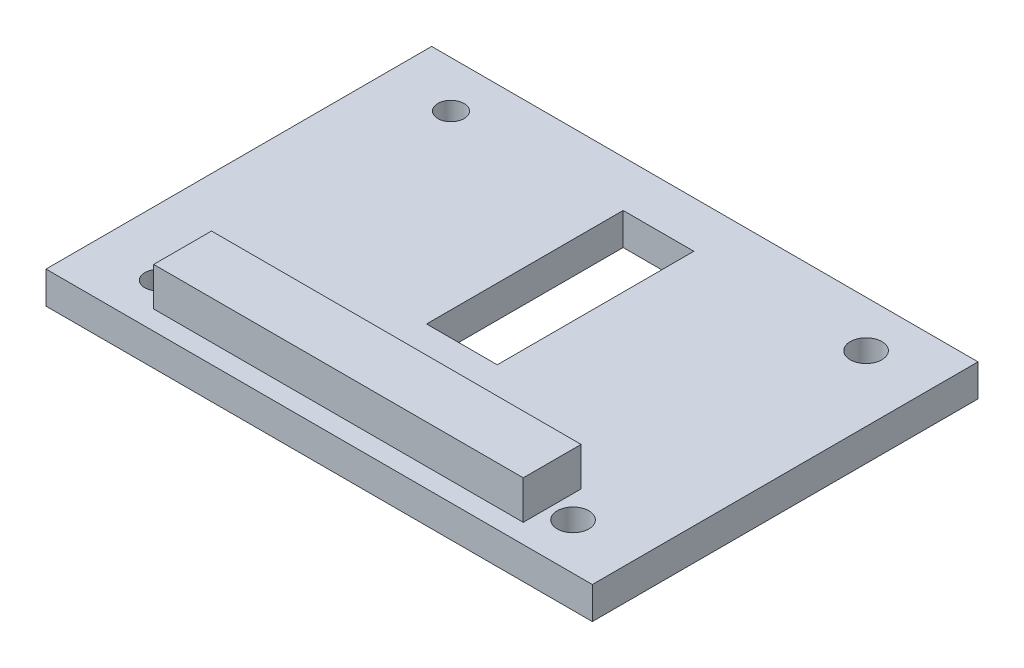
ISO-10303-21;
HEADER;
FILE_DESCRIPTION(('STEP AP214'),'2;1');
FILE_NAME('part.step','',(''),(''),'','','');
FILE_SCHEMA(('AUTOMOTIVE_DESIGN { 1 0 10303 214 1 1 1 1 }'));
ENDSEC;
DATA;
#1=APPLICATION_CONTEXT('core data for automotive mechanical design processes');
#2=APPLICATION_PROTOCOL_DEFINITION('international standard','automotive_design',2000,#1);
#3=PRODUCT_CONTEXT('',#1,'mechanical');
#4=PRODUCT('Part','Part','',(#3));
#5=PRODUCT_RELATED_PRODUCT_CATEGORY('part','',(#4));
#6=PRODUCT_DEFINITION_FORMATION('','',#4);
#7=PRODUCT_DEFINITION_CONTEXT('part definition',#1,'design');
#8=PRODUCT_DEFINITION('design','',#6,#7);
#9=PRODUCT_DEFINITION_SHAPE('','',#8);
#10=(LENGTH_UNIT() NAMED_UNIT(*) SI_UNIT(.MILLI.,.METRE.));
#11=(NAMED_UNIT(*) PLANE_ANGLE_UNIT() SI_UNIT($,.RADIAN.));
#12=(NAMED_UNIT(*) SI_UNIT($,.STERADIAN.) SOLID_ANGLE_UNIT());
#13=UNCERTAINTY_MEASURE_WITH_UNIT(LENGTH_MEASURE(1.E-05),#10,'distance_accuracy_value','');
#14=(GEOMETRIC_REPRESENTATION_CONTEXT(3) GLOBAL_UNCERTAINTY_ASSIGNED_CONTEXT((#13)) GLOBAL_UNIT_ASSIGNED_CONTEXT((#10,
#11,#12)) REPRESENTATION_CONTEXT('',''));
#15=CARTESIAN_POINT('',(0.,0.,0.));
#16=DIRECTION('',(0.,0.,1.));
#17=DIRECTION('',(1.,0.,0.));
#18=AXIS2_PLACEMENT_3D('',#15,#16,#17);
#19=CARTESIAN_POINT('',(0.,10.,0.));
#20=DIRECTION('',(0.,-1.,0.));
#21=DIRECTION('',(0.,0.,-1.));
#22=AXIS2_PLACEMENT_3D('',#19,#20,#21);
#23=PLANE('',#22);
#24=DIRECTION('',(0.,0.,-1.));
#25=VECTOR('',#24,1.);
#26=CARTESIAN_POINT('',(11.,10.,15.5889145496536));
#27=LINE('',#26,#25);
#28=CARTESIAN_POINT('',(11.,10.,15.5889145496536));
#29=VERTEX_POINT('',#28);
#30=CARTESIAN_POINT('',(11.,10.,-45.5889145496536));
#31=VERTEX_POINT('',#30);
#32=EDGE_CURVE('E160',#29,#31,#27,.T.);
#33=ORIENTED_EDGE('',*,*,#32,.F.);
#34=DIRECTION('',(1.,0.,0.));
#35=VECTOR('',#34,1.);
#36=CARTESIAN_POINT('',(-11.,10.,15.5889145496536));
#37=LINE('',#36,#35);
#38=CARTESIAN_POINT('',(-11.,10.,15.5889145496536));
#39=VERTEX_POINT('',#38);
#40=EDGE_CURVE('E168',#39,#29,#37,.T.);
#41=ORIENTED_EDGE('',*,*,#40,.F.);
#42=DIRECTION('',(0.,0.,1.));
#43=VECTOR('',#42,1.);
#44=CARTESIAN_POINT('',(-11.,10.,15.5889145496536));
#45=LINE('',#44,#43);
#46=CARTESIAN_POINT('',(-11.,10.,-45.5889145496536));
#47=VERTEX_POINT('',#46);
#48=EDGE_CURVE('E165',#47,#39,#45,.T.);
#49=ORIENTED_EDGE('',*,*,#48,.F.);
#50=DIRECTION('',(-1.,0.,0.));
#51=VECTOR('',#50,1.);
#52=CARTESIAN_POINT('',(-11.,10.,-45.5889145496536));
#53=LINE('',#52,#51);
#54=EDGE_CURVE('E162',#31,#47,#53,.T.);
#55=ORIENTED_EDGE('',*,*,#54,.F.);
#56=EDGE_LOOP('',(#33,#41,#49,#55));
#57=FACE_BOUND('',#56,.T.);
#58=DIRECTION('',(0.,0.,-1.));
#59=VECTOR('',#58,1.);
#60=CARTESIAN_POINT('',(85.,10.,60.));
#61=LINE('',#60,#59);
#62=CARTESIAN_POINT('',(85.,10.,60.));
#63=VERTEX_POINT('',#62);
#64=CARTESIAN_POINT('',(85.,10.,-60.));
#65=VERTEX_POINT('',#64);
#66=EDGE_CURVE('E215',#63,#65,#61,.T.);
#67=ORIENTED_EDGE('',*,*,#66,.T.);
#68=DIRECTION('',(-1.,0.,0.));
#69=VECTOR('',#68,1.);
#70=CARTESIAN_POINT('',(-85.,10.,-60.));
#71=LINE('',#70,#69);
#72=CARTESIAN_POINT('',(-85.,10.,-60.));
#73=VERTEX_POINT('',#72);
#74=EDGE_CURVE('E218',#65,#73,#71,.T.);
#75=ORIENTED_EDGE('',*,*,#74,.T.);
#76=DIRECTION('',(0.,0.,1.));
#77=VECTOR('',#76,1.);
#78=CARTESIAN_POINT('',(-85.,10.,60.));
#79=LINE('',#78,#77);
#80=CARTESIAN_POINT('',(-85.,10.,60.));
#81=VERTEX_POINT('',#80);
#82=EDGE_CURVE('E221',#73,#81,#79,.T.);
#83=ORIENTED_EDGE('',*,*,#82,.T.);
#84=DIRECTION('',(1.,0.,0.));
#85=VECTOR('',#84,1.);
#86=CARTESIAN_POINT('',(-85.,10.,60.));
#87=LINE('',#86,#85);
#88=EDGE_CURVE('E223',#81,#63,#87,.T.);
#89=ORIENTED_EDGE('',*,*,#88,.T.);
#90=EDGE_LOOP('',(#67,#75,#83,#89));
#91=FACE_BOUND('',#90,.T.);
#92=CARTESIAN_POINT('',(-64.5842956120092,10.,45.5889145496536));
#93=DIRECTION('',(0.,1.,0.));
#94=DIRECTION('',(0.,0.,1.));
#95=AXIS2_PLACEMENT_3D('',#92,#93,#94);
#96=CIRCLE('',#95,4.08429561200924);
#97=CARTESIAN_POINT('',(-64.5842956120092,10.,49.6732101616628));
#98=VERTEX_POINT('',#97);
#99=EDGE_CURVE('E209',#98,#98,#96,.T.);
#100=ORIENTED_EDGE('',*,*,#99,.F.);
#101=EDGE_LOOP('',(#100));
#102=FACE_BOUND('',#101,.T.);
#103=CARTESIAN_POINT('',(64.5842956120092,10.,45.5889145496536));
#104=DIRECTION('',(0.,1.,0.));
#105=DIRECTION('',(0.,0.,1.));
#106=AXIS2_PLACEMENT_3D('',#103,#104,#105);
#107=CIRCLE('',#106,4.91570438799077);
#108=CARTESIAN_POINT('',(64.5842956120092,10.,50.5046189376444));
#109=VERTEX_POINT('',#108);
#110=EDGE_CURVE('E203',#109,#109,#107,.T.);
#111=ORIENTED_EDGE('',*,*,#110,.F.);
#112=EDGE_LOOP('',(#111));
#113=FACE_BOUND('',#112,.T.);
#114=CARTESIAN_POINT('',(-64.5842956120092,10.,-45.5889145496536));
#115=DIRECTION('',(0.,1.,0.));
#116=DIRECTION('',(0.,0.,1.));
#117=AXIS2_PLACEMENT_3D('',#114,#115,#116);
#118=CIRCLE('',#117,4.08429561200924);
#119=CARTESIAN_POINT('',(-64.5842956120092,10.,-41.5046189376443));
#120=VERTEX_POINT('',#119);
#121=EDGE_CURVE('E197',#120,#120,#118,.T.);
#122=ORIENTED_EDGE('',*,*,#121,.F.);
#123=EDGE_LOOP('',(#122));
#124=FACE_BOUND('',#123,.T.);
#125=CARTESIAN_POINT('',(64.5842956120092,10.,-45.5889145496536));
#126=DIRECTION('',(0.,1.,0.));
#127=DIRECTION('',(0.,0.,1.));
#128=AXIS2_PLACEMENT_3D('',#125,#126,#127);
#129=CIRCLE('',#128,4.91570438799077);
#130=CARTESIAN_POINT('',(64.5842956120092,10.,-40.6732101616628));
#131=VERTEX_POINT('',#130);
#132=EDGE_CURVE('E191',#131,#131,#129,.T.);
#133=ORIENTED_EDGE('',*,*,#132,.F.);
#134=EDGE_LOOP('',(#133));
#135=FACE_BOUND('',#134,.T.);
#136=DIRECTION('',(0.,0.,-1.));
#137=VECTOR('',#136,1.);
#138=CARTESIAN_POINT('',(57.5,10.,0.));
#139=LINE('',#138,#137);
#140=CARTESIAN_POINT('',(57.5,10.,54.));
#141=VERTEX_POINT('',#140);
#142=CARTESIAN_POINT('',(57.5,10.,36.));
#143=VERTEX_POINT('',#142);
#144=EDGE_CURVE('E147',#141,#143,#139,.T.);
#145=ORIENTED_EDGE('',*,*,#144,.F.);
#146=DIRECTION('',(1.,0.,0.));
#147=VECTOR('',#146,1.);
#148=CARTESIAN_POINT('',(0.,10.,54.));
#149=LINE('',#148,#147);
#150=CARTESIAN_POINT('',(-57.5,10.,54.));
#151=VERTEX_POINT('',#150);
#152=EDGE_CURVE('E148',#151,#141,#149,.T.);
#153=ORIENTED_EDGE('',*,*,#152,.F.);
#154=DIRECTION('',(0.,0.,1.));
#155=VECTOR('',#154,1.);
#156=CARTESIAN_POINT('',(-57.5,10.,0.));
#157=LINE('',#156,#155);
#158=CARTESIAN_POINT('',(-57.5,10.,36.));
#159=VERTEX_POINT('',#158);
#160=EDGE_CURVE('E59',#159,#151,#157,.T.);
#161=ORIENTED_EDGE('',*,*,#160,.F.);
#162=DIRECTION('',(-1.,0.,0.));
#163=VECTOR('',#162,1.);
#164=CARTESIAN_POINT('',(0.,10.,36.));
#165=LINE('',#164,#163);
#166=EDGE_CURVE('E54',#143,#159,#165,.T.);
#167=ORIENTED_EDGE('',*,*,#166,.F.);
#168=EDGE_LOOP('',(#145,#153,#161,#167));
#169=FACE_BOUND('',#168,.T.);
#170=ADVANCED_FACE('F39',(#57,#91,#102,#113,#124,#135,#169),#23,.F.);
#171=CARTESIAN_POINT('',(0.,0.,0.));
#172=DIRECTION('',(0.,-1.,0.));
#173=DIRECTION('',(0.,0.,-1.));
#174=AXIS2_PLACEMENT_3D('',#171,#172,#173);
#175=PLANE('',#174);
#176=CARTESIAN_POINT('',(-64.5842956120092,0.,-45.5889145496536));
#177=DIRECTION('',(0.,1.,0.));
#178=DIRECTION('',(0.,0.,1.));
#179=AXIS2_PLACEMENT_3D('',#176,#177,#178);
#180=CIRCLE('',#179,4.08429561200924);
#181=CARTESIAN_POINT('',(-64.5842956120092,0.,-41.5046189376443));
#182=VERTEX_POINT('',#181);
#183=EDGE_CURVE('E194',#182,#182,#180,.T.);
#184=ORIENTED_EDGE('',*,*,#183,.T.);
#185=EDGE_LOOP('',(#184));
#186=FACE_BOUND('',#185,.T.);
#187=CARTESIAN_POINT('',(-64.5842956120092,0.,45.5889145496536));
#188=DIRECTION('',(0.,1.,0.));
#189=DIRECTION('',(0.,0.,1.));
#190=AXIS2_PLACEMENT_3D('',#187,#188,#189);
#191=CIRCLE('',#190,4.08429561200924);
#192=CARTESIAN_POINT('',(-64.5842956120092,0.,49.6732101616628));
#193=VERTEX_POINT('',#192);
#194=EDGE_CURVE('E206',#193,#193,#191,.T.);
#195=ORIENTED_EDGE('',*,*,#194,.T.);
#196=EDGE_LOOP('',(#195));
#197=FACE_BOUND('',#196,.T.);
#198=DIRECTION('',(0.,0.,-1.));
#199=VECTOR('',#198,1.);
#200=CARTESIAN_POINT('',(85.,0.,60.));
#201=LINE('',#200,#199);
#202=CARTESIAN_POINT('',(85.,0.,60.));
#203=VERTEX_POINT('',#202);
#204=CARTESIAN_POINT('',(85.,0.,-60.));
#205=VERTEX_POINT('',#204);
#206=EDGE_CURVE('E212',#203,#205,#201,.T.);
#207=ORIENTED_EDGE('',*,*,#206,.F.);
#208=DIRECTION('',(1.,0.,0.));
#209=VECTOR('',#208,1.);
#210=CARTESIAN_POINT('',(-85.,0.,60.));
#211=LINE('',#210,#209);
#212=CARTESIAN_POINT('',(-85.,0.,60.));
#213=VERTEX_POINT('',#212);
#214=EDGE_CURVE('E219',#213,#203,#211,.T.);
#215=ORIENTED_EDGE('',*,*,#214,.F.);
#216=DIRECTION('',(0.,0.,1.));
#217=VECTOR('',#216,1.);
#218=CARTESIAN_POINT('',(-85.,0.,60.));
#219=LINE('',#218,#217);
#220=CARTESIAN_POINT('',(-85.,0.,-60.));
#221=VERTEX_POINT('',#220);
#222=EDGE_CURVE('E230',#221,#213,#219,.T.);
#223=ORIENTED_EDGE('',*,*,#222,.F.);
#224=DIRECTION('',(-1.,0.,0.));
#225=VECTOR('',#224,1.);
#226=CARTESIAN_POINT('',(-85.,0.,-60.));
#227=LINE('',#226,#225);
#228=EDGE_CURVE('E228',#205,#221,#227,.T.);
#229=ORIENTED_EDGE('',*,*,#228,.F.);
#230=EDGE_LOOP('',(#207,#215,#223,#229));
#231=FACE_BOUND('',#230,.T.);
#232=CARTESIAN_POINT('',(64.5842956120092,0.,45.5889145496536));
#233=DIRECTION('',(0.,1.,0.));
#234=DIRECTION('',(0.,0.,1.));
#235=AXIS2_PLACEMENT_3D('',#232,#233,#234);
#236=CIRCLE('',#235,4.91570438799077);
#237=CARTESIAN_POINT('',(64.5842956120092,0.,50.5046189376444));
#238=VERTEX_POINT('',#237);
#239=EDGE_CURVE('E200',#238,#238,#236,.T.);
#240=ORIENTED_EDGE('',*,*,#239,.T.);
#241=EDGE_LOOP('',(#240));
#242=FACE_BOUND('',#241,.T.);
#243=CARTESIAN_POINT('',(64.5842956120092,0.,-45.5889145496536));
#244=DIRECTION('',(0.,1.,0.));
#245=DIRECTION('',(0.,0.,1.));
#246=AXIS2_PLACEMENT_3D('',#243,#244,#245);
#247=CIRCLE('',#246,4.91570438799077);
#248=CARTESIAN_POINT('',(64.5842956120092,0.,-40.6732101616628));
#249=VERTEX_POINT('',#248);
#250=EDGE_CURVE('E190',#249,#249,#247,.T.);
#251=ORIENTED_EDGE('',*,*,#250,.T.);
#252=EDGE_LOOP('',(#251));
#253=FACE_BOUND('',#252,.T.);
#254=DIRECTION('',(1.,0.,0.));
#255=VECTOR('',#254,1.);
#256=CARTESIAN_POINT('',(-11.,0.,15.5889145496536));
#257=LINE('',#256,#255);
#258=CARTESIAN_POINT('',(-11.,0.,15.5889145496536));
#259=VERTEX_POINT('',#258);
#260=CARTESIAN_POINT('',(11.,0.,15.5889145496536));
#261=VERTEX_POINT('',#260);
#262=EDGE_CURVE('E163',#259,#261,#257,.T.);
#263=ORIENTED_EDGE('',*,*,#262,.T.);
#264=DIRECTION('',(0.,0.,-1.));
#265=VECTOR('',#264,1.);
#266=CARTESIAN_POINT('',(11.,0.,15.5889145496536));
#267=LINE('',#266,#265);
#268=CARTESIAN_POINT('',(11.,0.,-45.5889145496536));
#269=VERTEX_POINT('',#268);
#270=EDGE_CURVE('E159',#261,#269,#267,.T.);
#271=ORIENTED_EDGE('',*,*,#270,.T.);
#272=DIRECTION('',(-1.,0.,0.));
#273=VECTOR('',#272,1.);
#274=CARTESIAN_POINT('',(-11.,0.,-45.5889145496536));
#275=LINE('',#274,#273);
#276=CARTESIAN_POINT('',(-11.,0.,-45.5889145496536));
#277=VERTEX_POINT('',#276);
#278=EDGE_CURVE('E173',#269,#277,#275,.T.);
#279=ORIENTED_EDGE('',*,*,#278,.T.);
#280=DIRECTION('',(0.,0.,1.));
#281=VECTOR('',#280,1.);
#282=CARTESIAN_POINT('',(-11.,0.,15.5889145496536));
#283=LINE('',#282,#281);
#284=EDGE_CURVE('E176',#277,#259,#283,.T.);
#285=ORIENTED_EDGE('',*,*,#284,.T.);
#286=EDGE_LOOP('',(#263,#271,#279,#285));
#287=FACE_BOUND('',#286,.T.);
#288=ADVANCED_FACE('F248',(#186,#197,#231,#242,#253,#287),#175,.T.);
#289=CARTESIAN_POINT('',(85.,10.,60.));
#290=DIRECTION('',(-1.,0.,0.));
#291=DIRECTION('',(0.,0.,1.));
#292=AXIS2_PLACEMENT_3D('',#289,#290,#291);
#293=PLANE('',#292);
#294=ORIENTED_EDGE('',*,*,#206,.T.);
#295=DIRECTION('',(0.,-1.,0.));
#296=VECTOR('',#295,1.);
#297=CARTESIAN_POINT('',(85.,10.,-60.));
#298=LINE('',#297,#296);
#299=EDGE_CURVE('E11',#65,#205,#298,.T.);
#300=ORIENTED_EDGE('',*,*,#299,.F.);
#301=ORIENTED_EDGE('',*,*,#66,.F.);
#302=DIRECTION('',(0.,-1.,0.));
#303=VECTOR('',#302,1.);
#304=CARTESIAN_POINT('',(85.,10.,60.));
#305=LINE('',#304,#303);
#306=EDGE_CURVE('E225',#63,#203,#305,.T.);
#307=ORIENTED_EDGE('',*,*,#306,.T.);
#308=EDGE_LOOP('',(#294,#300,#301,#307));
#309=FACE_BOUND('',#308,.T.);
#310=ADVANCED_FACE('F41',(#309),#293,.F.);
#311=CARTESIAN_POINT('',(-85.,10.,-60.));
#312=DIRECTION('',(0.,0.,1.));
#313=DIRECTION('',(1.,0.,0.));
#314=AXIS2_PLACEMENT_3D('',#311,#312,#313);
#315=PLANE('',#314);
#316=ORIENTED_EDGE('',*,*,#228,.T.);
#317=DIRECTION('',(0.,-1.,0.));
#318=VECTOR('',#317,1.);
#319=CARTESIAN_POINT('',(-85.,10.,-60.));
#320=LINE('',#319,#318);
#321=EDGE_CURVE('E47',#73,#221,#320,.T.);
#322=ORIENTED_EDGE('',*,*,#321,.F.);
#323=ORIENTED_EDGE('',*,*,#74,.F.);
#324=ORIENTED_EDGE('',*,*,#299,.T.);
#325=EDGE_LOOP('',(#316,#322,#323,#324));
#326=FACE_BOUND('',#325,.T.);
#327=ADVANCED_FACE('F259',(#326),#315,.F.);
#328=CARTESIAN_POINT('',(-85.,10.,60.));
#329=DIRECTION('',(1.,0.,0.));
#330=DIRECTION('',(0.,0.,-1.));
#331=AXIS2_PLACEMENT_3D('',#328,#329,#330);
#332=PLANE('',#331);
#333=ORIENTED_EDGE('',*,*,#222,.T.);
#334=DIRECTION('',(0.,-1.,0.));
#335=VECTOR('',#334,1.);
#336=CARTESIAN_POINT('',(-85.,10.,60.));
#337=LINE('',#336,#335);
#338=EDGE_CURVE('E235',#81,#213,#337,.T.);
#339=ORIENTED_EDGE('',*,*,#338,.F.);
#340=ORIENTED_EDGE('',*,*,#82,.F.);
#341=ORIENTED_EDGE('',*,*,#321,.T.);
#342=EDGE_LOOP('',(#333,#339,#340,#341));
#343=FACE_BOUND('',#342,.T.);
#344=ADVANCED_FACE('F242',(#343),#332,.F.);
#345=CARTESIAN_POINT('',(-85.,10.,60.));
#346=DIRECTION('',(0.,0.,-1.));
#347=DIRECTION('',(-1.,0.,0.));
#348=AXIS2_PLACEMENT_3D('',#345,#346,#347);
#349=PLANE('',#348);
#350=ORIENTED_EDGE('',*,*,#214,.T.);
#351=ORIENTED_EDGE('',*,*,#306,.F.);
#352=ORIENTED_EDGE('',*,*,#88,.F.);
#353=ORIENTED_EDGE('',*,*,#338,.T.);
#354=EDGE_LOOP('',(#350,#351,#352,#353));
#355=FACE_BOUND('',#354,.T.);
#356=ADVANCED_FACE('F252',(#355),#349,.F.);
#357=CARTESIAN_POINT('',(-64.5842956120092,10.,45.5889145496536));
#358=DIRECTION('',(0.,-1.,0.));
#359=DIRECTION('',(0.,0.,-1.));
#360=AXIS2_PLACEMENT_3D('',#357,#358,#359);
#361=CYLINDRICAL_SURFACE('',#360,4.08429561200924);
#362=ORIENTED_EDGE('',*,*,#99,.T.);
#363=EDGE_LOOP('',(#362));
#364=FACE_BOUND('',#363,.T.);
#365=ORIENTED_EDGE('',*,*,#194,.F.);
#366=EDGE_LOOP('',(#365));
#367=FACE_BOUND('',#366,.T.);
#368=ADVANCED_FACE('F276',(#364,#367),#361,.F.);
#369=CARTESIAN_POINT('',(64.5842956120092,10.,45.5889145496536));
#370=DIRECTION('',(0.,-1.,0.));
#371=DIRECTION('',(0.,0.,-1.));
#372=AXIS2_PLACEMENT_3D('',#369,#370,#371);
#373=CYLINDRICAL_SURFACE('',#372,4.91570438799077);
#374=ORIENTED_EDGE('',*,*,#110,.T.);
#375=EDGE_LOOP('',(#374));
#376=FACE_BOUND('',#375,.T.);
#377=ORIENTED_EDGE('',*,*,#239,.F.);
#378=EDGE_LOOP('',(#377));
#379=FACE_BOUND('',#378,.T.);
#380=ADVANCED_FACE('F283',(#376,#379),#373,.F.);
#381=CARTESIAN_POINT('',(-64.5842956120092,10.,-45.5889145496536));
#382=DIRECTION('',(0.,-1.,0.));
#383=DIRECTION('',(0.,0.,-1.));
#384=AXIS2_PLACEMENT_3D('',#381,#382,#383);
#385=CYLINDRICAL_SURFACE('',#384,4.08429561200924);
#386=ORIENTED_EDGE('',*,*,#121,.T.);
#387=EDGE_LOOP('',(#386));
#388=FACE_BOUND('',#387,.T.);
#389=ORIENTED_EDGE('',*,*,#183,.F.);
#390=EDGE_LOOP('',(#389));
#391=FACE_BOUND('',#390,.T.);
#392=ADVANCED_FACE('F288',(#388,#391),#385,.F.);
#393=CARTESIAN_POINT('',(64.5842956120092,10.,-45.5889145496536));
#394=DIRECTION('',(0.,-1.,0.));
#395=DIRECTION('',(0.,0.,-1.));
#396=AXIS2_PLACEMENT_3D('',#393,#394,#395);
#397=CYLINDRICAL_SURFACE('',#396,4.91570438799077);
#398=ORIENTED_EDGE('',*,*,#132,.T.);
#399=EDGE_LOOP('',(#398));
#400=FACE_BOUND('',#399,.T.);
#401=ORIENTED_EDGE('',*,*,#250,.F.);
#402=EDGE_LOOP('',(#401));
#403=FACE_BOUND('',#402,.T.);
#404=ADVANCED_FACE('F337',(#400,#403),#397,.F.);
#405=CARTESIAN_POINT('',(11.,10.,15.5889145496536));
#406=DIRECTION('',(-1.,0.,0.));
#407=DIRECTION('',(0.,0.,1.));
#408=AXIS2_PLACEMENT_3D('',#405,#406,#407);
#409=PLANE('',#408);
#410=ORIENTED_EDGE('',*,*,#270,.F.);
#411=DIRECTION('',(0.,-1.,0.));
#412=VECTOR('',#411,1.);
#413=CARTESIAN_POINT('',(11.,10.,15.5889145496536));
#414=LINE('',#413,#412);
#415=EDGE_CURVE('E170',#29,#261,#414,.T.);
#416=ORIENTED_EDGE('',*,*,#415,.F.);
#417=ORIENTED_EDGE('',*,*,#32,.T.);
#418=DIRECTION('',(0.,-1.,0.));
#419=VECTOR('',#418,1.);
#420=CARTESIAN_POINT('',(11.,10.,-45.5889145496536));
#421=LINE('',#420,#419);
#422=EDGE_CURVE('E187',#31,#269,#421,.T.);
#423=ORIENTED_EDGE('',*,*,#422,.T.);
#424=EDGE_LOOP('',(#410,#416,#417,#423));
#425=FACE_BOUND('',#424,.T.);
#426=ADVANCED_FACE('F333',(#425),#409,.T.);
#427=CARTESIAN_POINT('',(-11.,10.,-45.5889145496536));
#428=DIRECTION('',(0.,0.,1.));
#429=DIRECTION('',(1.,0.,0.));
#430=AXIS2_PLACEMENT_3D('',#427,#428,#429);
#431=PLANE('',#430);
#432=ORIENTED_EDGE('',*,*,#278,.F.);
#433=ORIENTED_EDGE('',*,*,#422,.F.);
#434=ORIENTED_EDGE('',*,*,#54,.T.);
#435=DIRECTION('',(0.,-1.,0.));
#436=VECTOR('',#435,1.);
#437=CARTESIAN_POINT('',(-11.,10.,-45.5889145496536));
#438=LINE('',#437,#436);
#439=EDGE_CURVE('E185',#47,#277,#438,.T.);
#440=ORIENTED_EDGE('',*,*,#439,.T.);
#441=EDGE_LOOP('',(#432,#433,#434,#440));
#442=FACE_BOUND('',#441,.T.);
#443=ADVANCED_FACE('F329',(#442),#431,.T.);
#444=CARTESIAN_POINT('',(-11.,10.,15.5889145496536));
#445=DIRECTION('',(1.,0.,0.));
#446=DIRECTION('',(0.,0.,-1.));
#447=AXIS2_PLACEMENT_3D('',#444,#445,#446);
#448=PLANE('',#447);
#449=ORIENTED_EDGE('',*,*,#284,.F.);
#450=ORIENTED_EDGE('',*,*,#439,.F.);
#451=ORIENTED_EDGE('',*,*,#48,.T.);
#452=DIRECTION('',(0.,-1.,0.));
#453=VECTOR('',#452,1.);
#454=CARTESIAN_POINT('',(-11.,10.,15.5889145496536));
#455=LINE('',#454,#453);
#456=EDGE_CURVE('E183',#39,#259,#455,.T.);
#457=ORIENTED_EDGE('',*,*,#456,.T.);
#458=EDGE_LOOP('',(#449,#450,#451,#457));
#459=FACE_BOUND('',#458,.T.);
#460=ADVANCED_FACE('F325',(#459),#448,.T.);
#461=CARTESIAN_POINT('',(-11.,10.,15.5889145496536));
#462=DIRECTION('',(0.,0.,-1.));
#463=DIRECTION('',(-1.,0.,0.));
#464=AXIS2_PLACEMENT_3D('',#461,#462,#463);
#465=PLANE('',#464);
#466=ORIENTED_EDGE('',*,*,#262,.F.);
#467=ORIENTED_EDGE('',*,*,#456,.F.);
#468=ORIENTED_EDGE('',*,*,#40,.T.);
#469=ORIENTED_EDGE('',*,*,#415,.T.);
#470=EDGE_LOOP('',(#466,#467,#468,#469));
#471=FACE_BOUND('',#470,.T.);
#472=ADVANCED_FACE('F322',(#471),#465,.T.);
#473=CARTESIAN_POINT('',(57.5,22.,54.));
#474=DIRECTION('',(-1.,0.,0.));
#475=DIRECTION('',(0.,0.,1.));
#476=AXIS2_PLACEMENT_3D('',#473,#474,#475);
#477=PLANE('',#476);
#478=DIRECTION('',(0.,-1.,0.));
#479=VECTOR('',#478,1.);
#480=CARTESIAN_POINT('',(57.5,22.,54.));
#481=LINE('',#480,#479);
#482=CARTESIAN_POINT('',(57.5,22.,54.));
#483=VERTEX_POINT('',#482);
#484=EDGE_CURVE('E303',#483,#141,#481,.T.);
#485=ORIENTED_EDGE('',*,*,#484,.T.);
#486=ORIENTED_EDGE('',*,*,#144,.T.);
#487=DIRECTION('',(0.,-1.,0.));
#488=VECTOR('',#487,1.);
#489=CARTESIAN_POINT('',(57.5,22.,36.));
#490=LINE('',#489,#488);
#491=CARTESIAN_POINT('',(57.5,22.,36.));
#492=VERTEX_POINT('',#491);
#493=EDGE_CURVE('E130',#492,#143,#490,.T.);
#494=ORIENTED_EDGE('',*,*,#493,.F.);
#495=DIRECTION('',(0.,0.,-1.));
#496=VECTOR('',#495,1.);
#497=CARTESIAN_POINT('',(57.5,22.,54.));
#498=LINE('',#497,#496);
#499=EDGE_CURVE('E136',#483,#492,#498,.T.);
#500=ORIENTED_EDGE('',*,*,#499,.F.);
#501=EDGE_LOOP('',(#485,#486,#494,#500));
#502=FACE_BOUND('',#501,.T.);
#503=ADVANCED_FACE('F146',(#502),#477,.F.);
#504=CARTESIAN_POINT('',(-57.5,22.,36.));
#505=DIRECTION('',(0.,0.,1.));
#506=DIRECTION('',(1.,0.,0.));
#507=AXIS2_PLACEMENT_3D('',#504,#505,#506);
#508=PLANE('',#507);
#509=ORIENTED_EDGE('',*,*,#493,.T.);
#510=ORIENTED_EDGE('',*,*,#166,.T.);
#511=DIRECTION('',(0.,-1.,0.));
#512=VECTOR('',#511,1.);
#513=CARTESIAN_POINT('',(-57.5,22.,36.));
#514=LINE('',#513,#512);
#515=CARTESIAN_POINT('',(-57.5,22.,36.));
#516=VERTEX_POINT('',#515);
#517=EDGE_CURVE('E132',#516,#159,#514,.T.);
#518=ORIENTED_EDGE('',*,*,#517,.F.);
#519=DIRECTION('',(-1.,0.,0.));
#520=VECTOR('',#519,1.);
#521=CARTESIAN_POINT('',(-57.5,22.,36.));
#522=LINE('',#521,#520);
#523=EDGE_CURVE('E126',#492,#516,#522,.T.);
#524=ORIENTED_EDGE('',*,*,#523,.F.);
#525=EDGE_LOOP('',(#509,#510,#518,#524));
#526=FACE_BOUND('',#525,.T.);
#527=ADVANCED_FACE('F128',(#526),#508,.F.);
#528=CARTESIAN_POINT('',(-57.5,22.,54.));
#529=DIRECTION('',(1.,0.,0.));
#530=DIRECTION('',(0.,0.,-1.));
#531=AXIS2_PLACEMENT_3D('',#528,#529,#530);
#532=PLANE('',#531);
#533=ORIENTED_EDGE('',*,*,#517,.T.);
#534=ORIENTED_EDGE('',*,*,#160,.T.);
#535=DIRECTION('',(0.,-1.,0.));
#536=VECTOR('',#535,1.);
#537=CARTESIAN_POINT('',(-57.5,22.,54.));
#538=LINE('',#537,#536);
#539=CARTESIAN_POINT('',(-57.5,22.,54.));
#540=VERTEX_POINT('',#539);
#541=EDGE_CURVE('E152',#540,#151,#538,.T.);
#542=ORIENTED_EDGE('',*,*,#541,.F.);
#543=DIRECTION('',(0.,0.,1.));
#544=VECTOR('',#543,1.);
#545=CARTESIAN_POINT('',(-57.5,22.,54.));
#546=LINE('',#545,#544);
#547=EDGE_CURVE('E135',#516,#540,#546,.T.);
#548=ORIENTED_EDGE('',*,*,#547,.F.);
#549=EDGE_LOOP('',(#533,#534,#542,#548));
#550=FACE_BOUND('',#549,.T.);
#551=ADVANCED_FACE('F309',(#550),#532,.F.);
#552=CARTESIAN_POINT('',(-57.5,22.,54.));
#553=DIRECTION('',(0.,0.,-1.));
#554=DIRECTION('',(-1.,0.,0.));
#555=AXIS2_PLACEMENT_3D('',#552,#553,#554);
#556=PLANE('',#555);
#557=ORIENTED_EDGE('',*,*,#541,.T.);
#558=ORIENTED_EDGE('',*,*,#152,.T.);
#559=ORIENTED_EDGE('',*,*,#484,.F.);
#560=DIRECTION('',(1.,0.,0.));
#561=VECTOR('',#560,1.);
#562=CARTESIAN_POINT('',(-57.5,22.,54.));
#563=LINE('',#562,#561);
#564=EDGE_CURVE('E141',#540,#483,#563,.T.);
#565=ORIENTED_EDGE('',*,*,#564,.F.);
#566=EDGE_LOOP('',(#557,#558,#559,#565));
#567=FACE_BOUND('',#566,.T.);
#568=ADVANCED_FACE('F302',(#567),#556,.F.);
#569=CARTESIAN_POINT('',(0.,22.,0.));
#570=DIRECTION('',(0.,-1.,0.));
#571=DIRECTION('',(0.,0.,-1.));
#572=AXIS2_PLACEMENT_3D('',#569,#570,#571);
#573=PLANE('',#572);
#574=ORIENTED_EDGE('',*,*,#499,.T.);
#575=ORIENTED_EDGE('',*,*,#523,.T.);
#576=ORIENTED_EDGE('',*,*,#547,.T.);
#577=ORIENTED_EDGE('',*,*,#564,.T.);
#578=EDGE_LOOP('',(#574,#575,#576,#577));
#579=FACE_BOUND('',#578,.T.);
#580=ADVANCED_FACE('F139',(#579),#573,.F.);
#581=CLOSED_SHELL('',(#170,#288,#310,#327,#344,#356,#368,#380,#392,#404,#426,#443,#460,#472,
#503,#527,#551,#568,#580));
#582=MANIFOLD_SOLID_BREP('B2',#581);
#583=ADVANCED_BREP_SHAPE_REPRESENTATION('',(#18,#582),#14);
#584=SHAPE_DEFINITION_REPRESENTATION(#9,#583);
ENDSEC;
END-ISO-10303-21;
